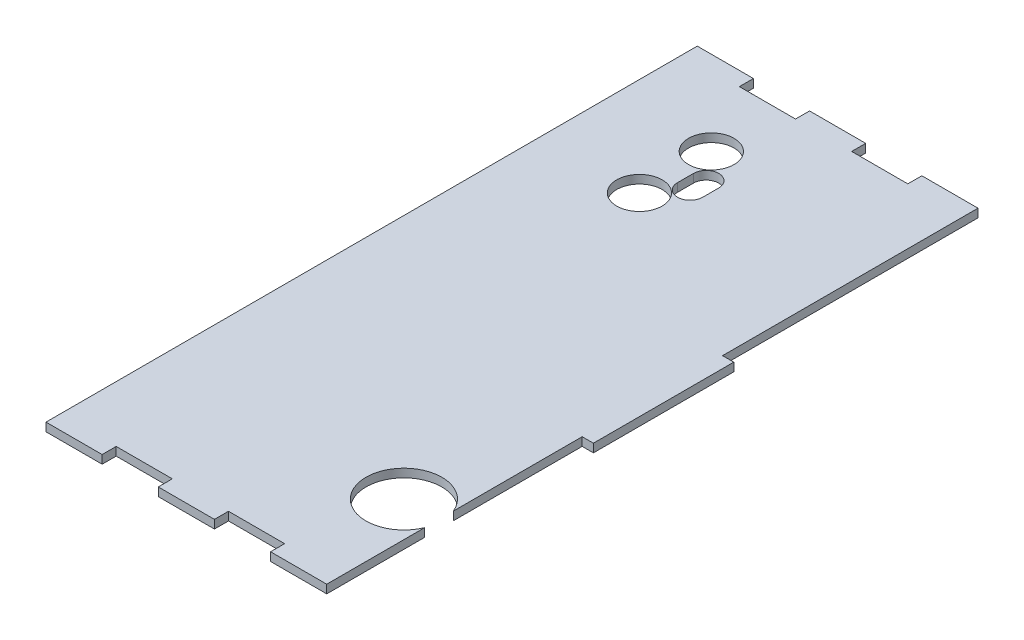
ISO-10303-21;
HEADER;
FILE_DESCRIPTION(('STEP AP214'),'2;1');
FILE_NAME('part.step','',(''),(''),'','','');
FILE_SCHEMA(('AUTOMOTIVE_DESIGN { 1 0 10303 214 1 1 1 1 }'));
ENDSEC;
DATA;
#1=APPLICATION_CONTEXT('core data for automotive mechanical design processes');
#2=APPLICATION_PROTOCOL_DEFINITION('international standard','automotive_design',2000,#1);
#3=PRODUCT_CONTEXT('',#1,'mechanical');
#4=PRODUCT('Part','Part','',(#3));
#5=PRODUCT_RELATED_PRODUCT_CATEGORY('part','',(#4));
#6=PRODUCT_DEFINITION_FORMATION('','',#4);
#7=PRODUCT_DEFINITION_CONTEXT('part definition',#1,'design');
#8=PRODUCT_DEFINITION('design','',#6,#7);
#9=PRODUCT_DEFINITION_SHAPE('','',#8);
#10=(LENGTH_UNIT() NAMED_UNIT(*) SI_UNIT(.MILLI.,.METRE.));
#11=(NAMED_UNIT(*) PLANE_ANGLE_UNIT() SI_UNIT($,.RADIAN.));
#12=(NAMED_UNIT(*) SI_UNIT($,.STERADIAN.) SOLID_ANGLE_UNIT());
#13=UNCERTAINTY_MEASURE_WITH_UNIT(LENGTH_MEASURE(1.E-05),#10,'distance_accuracy_value','');
#14=(GEOMETRIC_REPRESENTATION_CONTEXT(3) GLOBAL_UNCERTAINTY_ASSIGNED_CONTEXT((#13)) GLOBAL_UNIT_ASSIGNED_CONTEXT((#10,
#11,#12)) REPRESENTATION_CONTEXT('',''));
#15=CARTESIAN_POINT('',(0.,0.,0.));
#16=DIRECTION('',(0.,0.,1.));
#17=DIRECTION('',(1.,0.,0.));
#18=AXIS2_PLACEMENT_3D('',#15,#16,#17);
#19=CARTESIAN_POINT('',(37.5,3.,76.));
#20=DIRECTION('',(0.,1.,0.));
#21=DIRECTION('',(0.,0.,1.));
#22=AXIS2_PLACEMENT_3D('',#19,#20,#21);
#23=PLANE('',#22);
#24=CARTESIAN_POINT('',(-15.,3.,-60.4));
#25=DIRECTION('',(0.,1.,0.));
#26=DIRECTION('',(0.,0.,1.));
#27=AXIS2_PLACEMENT_3D('',#24,#25,#26);
#28=CIRCLE('',#27,8.09999999999999);
#29=CARTESIAN_POINT('',(-15.,3.,-52.3));
#30=VERTEX_POINT('',#29);
#31=EDGE_CURVE('E293',#30,#30,#28,.T.);
#32=ORIENTED_EDGE('',*,*,#31,.F.);
#33=EDGE_LOOP('',(#32));
#34=FACE_BOUND('',#33,.T.);
#35=DIRECTION('',(0.,0.,1.));
#36=VECTOR('',#35,1.);
#37=CARTESIAN_POINT('',(-50.,3.,-111.));
#38=LINE('',#37,#36);
#39=CARTESIAN_POINT('',(-50.,3.,-116.));
#40=VERTEX_POINT('',#39);
#41=CARTESIAN_POINT('',(-50.,3.,116.));
#42=VERTEX_POINT('',#41);
#43=EDGE_CURVE('E301',#40,#42,#38,.T.);
#44=ORIENTED_EDGE('',*,*,#43,.T.);
#45=DIRECTION('',(1.,0.,0.));
#46=VECTOR('',#45,1.);
#47=CARTESIAN_POINT('',(-50.,3.,116.));
#48=LINE('',#47,#46);
#49=CARTESIAN_POINT('',(-30.,3.,116.));
#50=VERTEX_POINT('',#49);
#51=EDGE_CURVE('E304',#42,#50,#48,.T.);
#52=ORIENTED_EDGE('',*,*,#51,.T.);
#53=DIRECTION('',(0.,0.,-1.));
#54=VECTOR('',#53,1.);
#55=CARTESIAN_POINT('',(-30.,3.,116.));
#56=LINE('',#55,#54);
#57=CARTESIAN_POINT('',(-30.,3.,111.));
#58=VERTEX_POINT('',#57);
#59=EDGE_CURVE('E308',#50,#58,#56,.T.);
#60=ORIENTED_EDGE('',*,*,#59,.T.);
#61=DIRECTION('',(1.,0.,0.));
#62=VECTOR('',#61,1.);
#63=CARTESIAN_POINT('',(-9.99999999999999,3.,111.));
#64=LINE('',#63,#62);
#65=CARTESIAN_POINT('',(-9.99999999999999,3.,111.));
#66=VERTEX_POINT('',#65);
#67=EDGE_CURVE('E311',#58,#66,#64,.T.);
#68=ORIENTED_EDGE('',*,*,#67,.T.);
#69=DIRECTION('',(0.,0.,1.));
#70=VECTOR('',#69,1.);
#71=CARTESIAN_POINT('',(-9.99999999999999,3.,111.));
#72=LINE('',#71,#70);
#73=CARTESIAN_POINT('',(-9.99999999999999,3.,116.));
#74=VERTEX_POINT('',#73);
#75=EDGE_CURVE('E314',#66,#74,#72,.T.);
#76=ORIENTED_EDGE('',*,*,#75,.T.);
#77=DIRECTION('',(1.,0.,0.));
#78=VECTOR('',#77,1.);
#79=CARTESIAN_POINT('',(-9.99999999999999,3.,116.));
#80=LINE('',#79,#78);
#81=CARTESIAN_POINT('',(10.,3.,116.));
#82=VERTEX_POINT('',#81);
#83=EDGE_CURVE('E317',#74,#82,#80,.T.);
#84=ORIENTED_EDGE('',*,*,#83,.T.);
#85=DIRECTION('',(0.,0.,-1.));
#86=VECTOR('',#85,1.);
#87=CARTESIAN_POINT('',(10.,3.,116.));
#88=LINE('',#87,#86);
#89=CARTESIAN_POINT('',(10.,3.,111.));
#90=VERTEX_POINT('',#89);
#91=EDGE_CURVE('E320',#82,#90,#88,.T.);
#92=ORIENTED_EDGE('',*,*,#91,.T.);
#93=DIRECTION('',(1.,0.,0.));
#94=VECTOR('',#93,1.);
#95=CARTESIAN_POINT('',(30.,3.,111.));
#96=LINE('',#95,#94);
#97=CARTESIAN_POINT('',(30.,3.,111.));
#98=VERTEX_POINT('',#97);
#99=EDGE_CURVE('E323',#90,#98,#96,.T.);
#100=ORIENTED_EDGE('',*,*,#99,.T.);
#101=DIRECTION('',(0.,0.,1.));
#102=VECTOR('',#101,1.);
#103=CARTESIAN_POINT('',(30.,3.,111.));
#104=LINE('',#103,#102);
#105=CARTESIAN_POINT('',(30.,3.,116.));
#106=VERTEX_POINT('',#105);
#107=EDGE_CURVE('E326',#98,#106,#104,.T.);
#108=ORIENTED_EDGE('',*,*,#107,.T.);
#109=DIRECTION('',(1.,0.,0.));
#110=VECTOR('',#109,1.);
#111=CARTESIAN_POINT('',(30.,3.,116.));
#112=LINE('',#111,#110);
#113=CARTESIAN_POINT('',(50.,3.,116.));
#114=VERTEX_POINT('',#113);
#115=EDGE_CURVE('E329',#106,#114,#112,.T.);
#116=ORIENTED_EDGE('',*,*,#115,.T.);
#117=DIRECTION('',(0.,0.,-1.));
#118=VECTOR('',#117,1.);
#119=CARTESIAN_POINT('',(50.,3.,116.));
#120=LINE('',#119,#118);
#121=CARTESIAN_POINT('',(50.,3.,81.0990195135928));
#122=VERTEX_POINT('',#121);
#123=EDGE_CURVE('E332',#114,#122,#120,.T.);
#124=ORIENTED_EDGE('',*,*,#123,.T.);
#125=CARTESIAN_POINT('',(37.5,3.,76.));
#126=DIRECTION('',(0.,-1.,0.));
#127=DIRECTION('',(0.,0.,1.));
#128=AXIS2_PLACEMENT_3D('',#125,#126,#127);
#129=CIRCLE('',#128,13.5);
#130=CARTESIAN_POINT('',(50.,3.,70.9009804864072));
#131=VERTEX_POINT('',#130);
#132=EDGE_CURVE('E335',#122,#131,#129,.T.);
#133=ORIENTED_EDGE('',*,*,#132,.T.);
#134=DIRECTION('',(0.,0.,-1.));
#135=VECTOR('',#134,1.);
#136=CARTESIAN_POINT('',(50.,3.,25.));
#137=LINE('',#136,#135);
#138=CARTESIAN_POINT('',(50.,3.,25.));
#139=VERTEX_POINT('',#138);
#140=EDGE_CURVE('E338',#131,#139,#137,.T.);
#141=ORIENTED_EDGE('',*,*,#140,.T.);
#142=DIRECTION('',(1.,0.,0.));
#143=VECTOR('',#142,1.);
#144=CARTESIAN_POINT('',(50.,3.,25.));
#145=LINE('',#144,#143);
#146=CARTESIAN_POINT('',(54.,3.,25.));
#147=VERTEX_POINT('',#146);
#148=EDGE_CURVE('E341',#139,#147,#145,.T.);
#149=ORIENTED_EDGE('',*,*,#148,.T.);
#150=DIRECTION('',(0.,0.,-1.));
#151=VECTOR('',#150,1.);
#152=CARTESIAN_POINT('',(54.,3.,25.));
#153=LINE('',#152,#151);
#154=CARTESIAN_POINT('',(54.,3.,-25.));
#155=VERTEX_POINT('',#154);
#156=EDGE_CURVE('E344',#147,#155,#153,.T.);
#157=ORIENTED_EDGE('',*,*,#156,.T.);
#158=DIRECTION('',(-1.,0.,0.));
#159=VECTOR('',#158,1.);
#160=CARTESIAN_POINT('',(50.,3.,-25.));
#161=LINE('',#160,#159);
#162=CARTESIAN_POINT('',(50.,3.,-25.));
#163=VERTEX_POINT('',#162);
#164=EDGE_CURVE('E347',#155,#163,#161,.T.);
#165=ORIENTED_EDGE('',*,*,#164,.T.);
#166=DIRECTION('',(0.,0.,-1.));
#167=VECTOR('',#166,1.);
#168=CARTESIAN_POINT('',(50.,3.,-111.));
#169=LINE('',#168,#167);
#170=CARTESIAN_POINT('',(49.9999999999999,3.,-116.));
#171=VERTEX_POINT('',#170);
#172=EDGE_CURVE('E350',#163,#171,#169,.T.);
#173=ORIENTED_EDGE('',*,*,#172,.T.);
#174=DIRECTION('',(-1.,0.,0.));
#175=VECTOR('',#174,1.);
#176=CARTESIAN_POINT('',(29.9999999999999,3.,-116.));
#177=LINE('',#176,#175);
#178=CARTESIAN_POINT('',(29.9999999999999,3.,-116.));
#179=VERTEX_POINT('',#178);
#180=EDGE_CURVE('E353',#171,#179,#177,.T.);
#181=ORIENTED_EDGE('',*,*,#180,.T.);
#182=DIRECTION('',(0.,0.,1.));
#183=VECTOR('',#182,1.);
#184=CARTESIAN_POINT('',(29.9999999999999,3.,-111.));
#185=LINE('',#184,#183);
#186=CARTESIAN_POINT('',(29.9999999999999,3.,-111.));
#187=VERTEX_POINT('',#186);
#188=EDGE_CURVE('E356',#179,#187,#185,.T.);
#189=ORIENTED_EDGE('',*,*,#188,.T.);
#190=DIRECTION('',(-1.,0.,0.));
#191=VECTOR('',#190,1.);
#192=CARTESIAN_POINT('',(29.9999999999999,3.,-111.));
#193=LINE('',#192,#191);
#194=CARTESIAN_POINT('',(9.99999999999993,3.,-111.));
#195=VERTEX_POINT('',#194);
#196=EDGE_CURVE('E359',#187,#195,#193,.T.);
#197=ORIENTED_EDGE('',*,*,#196,.T.);
#198=DIRECTION('',(0.,0.,-1.));
#199=VECTOR('',#198,1.);
#200=CARTESIAN_POINT('',(9.99999999999991,3.,-116.));
#201=LINE('',#200,#199);
#202=CARTESIAN_POINT('',(9.99999999999991,3.,-116.));
#203=VERTEX_POINT('',#202);
#204=EDGE_CURVE('E362',#195,#203,#201,.T.);
#205=ORIENTED_EDGE('',*,*,#204,.T.);
#206=DIRECTION('',(-1.,0.,0.));
#207=VECTOR('',#206,1.);
#208=CARTESIAN_POINT('',(-10.0000000000001,3.,-116.));
#209=LINE('',#208,#207);
#210=CARTESIAN_POINT('',(-10.0000000000001,3.,-116.));
#211=VERTEX_POINT('',#210);
#212=EDGE_CURVE('E365',#203,#211,#209,.T.);
#213=ORIENTED_EDGE('',*,*,#212,.T.);
#214=DIRECTION('',(0.,0.,1.));
#215=VECTOR('',#214,1.);
#216=CARTESIAN_POINT('',(-10.0000000000001,3.,-111.));
#217=LINE('',#216,#215);
#218=CARTESIAN_POINT('',(-10.0000000000001,3.,-111.));
#219=VERTEX_POINT('',#218);
#220=EDGE_CURVE('E368',#211,#219,#217,.T.);
#221=ORIENTED_EDGE('',*,*,#220,.T.);
#222=DIRECTION('',(-1.,0.,0.));
#223=VECTOR('',#222,1.);
#224=CARTESIAN_POINT('',(-10.0000000000001,3.,-111.));
#225=LINE('',#224,#223);
#226=CARTESIAN_POINT('',(-30.0000000000001,3.,-111.));
#227=VERTEX_POINT('',#226);
#228=EDGE_CURVE('E371',#219,#227,#225,.T.);
#229=ORIENTED_EDGE('',*,*,#228,.T.);
#230=DIRECTION('',(0.,0.,-1.));
#231=VECTOR('',#230,1.);
#232=CARTESIAN_POINT('',(-30.0000000000001,3.,-116.));
#233=LINE('',#232,#231);
#234=CARTESIAN_POINT('',(-30.0000000000001,3.,-116.));
#235=VERTEX_POINT('',#234);
#236=EDGE_CURVE('E374',#227,#235,#233,.T.);
#237=ORIENTED_EDGE('',*,*,#236,.T.);
#238=DIRECTION('',(-1.,0.,0.));
#239=VECTOR('',#238,1.);
#240=CARTESIAN_POINT('',(-50.,3.,-116.));
#241=LINE('',#240,#239);
#242=EDGE_CURVE('E377',#235,#40,#241,.T.);
#243=ORIENTED_EDGE('',*,*,#242,.T.);
#244=EDGE_LOOP('',(#44,#52,#60,#68,#76,#84,#92,#100,#108,#116,#124,#133,#141,#149,#157,#165,
#173,#181,#189,#197,#205,#213,#221,#229,#237,#243));
#245=FACE_BOUND('',#244,.T.);
#246=CARTESIAN_POINT('',(-15.,3.,-86.));
#247=DIRECTION('',(0.,1.,0.));
#248=DIRECTION('',(0.,0.,1.));
#249=AXIS2_PLACEMENT_3D('',#246,#247,#248);
#250=CIRCLE('',#249,8.09999999999999);
#251=CARTESIAN_POINT('',(-15.,3.,-77.9));
#252=VERTEX_POINT('',#251);
#253=EDGE_CURVE('E285',#252,#252,#250,.T.);
#254=ORIENTED_EDGE('',*,*,#253,.F.);
#255=EDGE_LOOP('',(#254));
#256=FACE_BOUND('',#255,.T.);
#257=DIRECTION('',(0.,0.,-1.));
#258=VECTOR('',#257,1.);
#259=CARTESIAN_POINT('',(-2.4,3.,-70.35));
#260=LINE('',#259,#258);
#261=CARTESIAN_POINT('',(-2.4,3.,-70.35));
#262=VERTEX_POINT('',#261);
#263=CARTESIAN_POINT('',(-2.4,3.,-76.05));
#264=VERTEX_POINT('',#263);
#265=EDGE_CURVE('E246',#262,#264,#260,.T.);
#266=ORIENTED_EDGE('',*,*,#265,.F.);
#267=CARTESIAN_POINT('',(-6.9,3.,-70.35));
#268=DIRECTION('',(0.,1.,0.));
#269=DIRECTION('',(0.,0.,1.));
#270=AXIS2_PLACEMENT_3D('',#267,#268,#269);
#271=CIRCLE('',#270,4.5);
#272=CARTESIAN_POINT('',(-11.4,3.,-70.35));
#273=VERTEX_POINT('',#272);
#274=EDGE_CURVE('E237',#273,#262,#271,.T.);
#275=ORIENTED_EDGE('',*,*,#274,.F.);
#276=DIRECTION('',(0.,0.,1.));
#277=VECTOR('',#276,1.);
#278=CARTESIAN_POINT('',(-11.4,3.,-70.35));
#279=LINE('',#278,#277);
#280=CARTESIAN_POINT('',(-11.4,3.,-76.05));
#281=VERTEX_POINT('',#280);
#282=EDGE_CURVE('E263',#281,#273,#279,.T.);
#283=ORIENTED_EDGE('',*,*,#282,.F.);
#284=CARTESIAN_POINT('',(-6.9,3.,-76.05));
#285=DIRECTION('',(0.,1.,0.));
#286=DIRECTION('',(0.,0.,1.));
#287=AXIS2_PLACEMENT_3D('',#284,#285,#286);
#288=CIRCLE('',#287,4.5);
#289=EDGE_CURVE('E259',#264,#281,#288,.T.);
#290=ORIENTED_EDGE('',*,*,#289,.F.);
#291=EDGE_LOOP('',(#266,#275,#283,#290));
#292=FACE_BOUND('',#291,.T.);
#293=ADVANCED_FACE('F39',(#34,#245,#256,#292),#23,.T.);
#294=CARTESIAN_POINT('',(37.5,0.,76.));
#295=DIRECTION('',(0.,1.,0.));
#296=DIRECTION('',(0.,0.,1.));
#297=AXIS2_PLACEMENT_3D('',#294,#295,#296);
#298=PLANE('',#297);
#299=CARTESIAN_POINT('',(-15.,0.,-86.));
#300=DIRECTION('',(0.,1.,0.));
#301=DIRECTION('',(0.,0.,1.));
#302=AXIS2_PLACEMENT_3D('',#299,#300,#301);
#303=CIRCLE('',#302,8.09999999999999);
#304=CARTESIAN_POINT('',(-15.,0.,-77.9));
#305=VERTEX_POINT('',#304);
#306=EDGE_CURVE('E255',#305,#305,#303,.T.);
#307=ORIENTED_EDGE('',*,*,#306,.T.);
#308=EDGE_LOOP('',(#307));
#309=FACE_BOUND('',#308,.T.);
#310=CARTESIAN_POINT('',(-15.,0.,-60.4));
#311=DIRECTION('',(0.,1.,0.));
#312=DIRECTION('',(0.,0.,1.));
#313=AXIS2_PLACEMENT_3D('',#310,#311,#312);
#314=CIRCLE('',#313,8.09999999999999);
#315=CARTESIAN_POINT('',(-15.,0.,-52.3));
#316=VERTEX_POINT('',#315);
#317=EDGE_CURVE('E289',#316,#316,#314,.T.);
#318=ORIENTED_EDGE('',*,*,#317,.T.);
#319=EDGE_LOOP('',(#318));
#320=FACE_BOUND('',#319,.T.);
#321=DIRECTION('',(1.,0.,0.));
#322=VECTOR('',#321,1.);
#323=CARTESIAN_POINT('',(-50.,0.,116.));
#324=LINE('',#323,#322);
#325=CARTESIAN_POINT('',(-50.,0.,116.));
#326=VERTEX_POINT('',#325);
#327=CARTESIAN_POINT('',(-30.,0.,116.));
#328=VERTEX_POINT('',#327);
#329=EDGE_CURVE('E297',#326,#328,#324,.T.);
#330=ORIENTED_EDGE('',*,*,#329,.F.);
#331=DIRECTION('',(0.,0.,1.));
#332=VECTOR('',#331,1.);
#333=CARTESIAN_POINT('',(-50.,0.,-111.));
#334=LINE('',#333,#332);
#335=CARTESIAN_POINT('',(-50.,0.,-116.));
#336=VERTEX_POINT('',#335);
#337=EDGE_CURVE('E305',#336,#326,#334,.T.);
#338=ORIENTED_EDGE('',*,*,#337,.F.);
#339=DIRECTION('',(-1.,0.,0.));
#340=VECTOR('',#339,1.);
#341=CARTESIAN_POINT('',(-50.,0.,-116.));
#342=LINE('',#341,#340);
#343=CARTESIAN_POINT('',(-30.0000000000001,0.,-116.));
#344=VERTEX_POINT('',#343);
#345=EDGE_CURVE('E455',#344,#336,#342,.T.);
#346=ORIENTED_EDGE('',*,*,#345,.F.);
#347=DIRECTION('',(0.,0.,-1.));
#348=VECTOR('',#347,1.);
#349=CARTESIAN_POINT('',(-30.0000000000001,0.,-116.));
#350=LINE('',#349,#348);
#351=CARTESIAN_POINT('',(-30.0000000000001,0.,-111.));
#352=VERTEX_POINT('',#351);
#353=EDGE_CURVE('E452',#352,#344,#350,.T.);
#354=ORIENTED_EDGE('',*,*,#353,.F.);
#355=DIRECTION('',(-1.,0.,0.));
#356=VECTOR('',#355,1.);
#357=CARTESIAN_POINT('',(-10.0000000000001,0.,-111.));
#358=LINE('',#357,#356);
#359=CARTESIAN_POINT('',(-10.0000000000001,0.,-111.));
#360=VERTEX_POINT('',#359);
#361=EDGE_CURVE('E449',#360,#352,#358,.T.);
#362=ORIENTED_EDGE('',*,*,#361,.F.);
#363=DIRECTION('',(0.,0.,1.));
#364=VECTOR('',#363,1.);
#365=CARTESIAN_POINT('',(-10.0000000000001,0.,-111.));
#366=LINE('',#365,#364);
#367=CARTESIAN_POINT('',(-10.0000000000001,0.,-116.));
#368=VERTEX_POINT('',#367);
#369=EDGE_CURVE('E446',#368,#360,#366,.T.);
#370=ORIENTED_EDGE('',*,*,#369,.F.);
#371=DIRECTION('',(-1.,0.,0.));
#372=VECTOR('',#371,1.);
#373=CARTESIAN_POINT('',(-10.0000000000001,0.,-116.));
#374=LINE('',#373,#372);
#375=CARTESIAN_POINT('',(9.99999999999991,0.,-116.));
#376=VERTEX_POINT('',#375);
#377=EDGE_CURVE('E443',#376,#368,#374,.T.);
#378=ORIENTED_EDGE('',*,*,#377,.F.);
#379=DIRECTION('',(0.,0.,-1.));
#380=VECTOR('',#379,1.);
#381=CARTESIAN_POINT('',(9.99999999999991,0.,-116.));
#382=LINE('',#381,#380);
#383=CARTESIAN_POINT('',(9.99999999999993,0.,-111.));
#384=VERTEX_POINT('',#383);
#385=EDGE_CURVE('E440',#384,#376,#382,.T.);
#386=ORIENTED_EDGE('',*,*,#385,.F.);
#387=DIRECTION('',(-1.,0.,0.));
#388=VECTOR('',#387,1.);
#389=CARTESIAN_POINT('',(29.9999999999999,0.,-111.));
#390=LINE('',#389,#388);
#391=CARTESIAN_POINT('',(29.9999999999999,0.,-111.));
#392=VERTEX_POINT('',#391);
#393=EDGE_CURVE('E437',#392,#384,#390,.T.);
#394=ORIENTED_EDGE('',*,*,#393,.F.);
#395=DIRECTION('',(0.,0.,1.));
#396=VECTOR('',#395,1.);
#397=CARTESIAN_POINT('',(29.9999999999999,0.,-111.));
#398=LINE('',#397,#396);
#399=CARTESIAN_POINT('',(29.9999999999999,0.,-116.));
#400=VERTEX_POINT('',#399);
#401=EDGE_CURVE('E434',#400,#392,#398,.T.);
#402=ORIENTED_EDGE('',*,*,#401,.F.);
#403=DIRECTION('',(-1.,0.,0.));
#404=VECTOR('',#403,1.);
#405=CARTESIAN_POINT('',(29.9999999999999,0.,-116.));
#406=LINE('',#405,#404);
#407=CARTESIAN_POINT('',(49.9999999999999,0.,-116.));
#408=VERTEX_POINT('',#407);
#409=EDGE_CURVE('E431',#408,#400,#406,.T.);
#410=ORIENTED_EDGE('',*,*,#409,.F.);
#411=DIRECTION('',(0.,0.,-1.));
#412=VECTOR('',#411,1.);
#413=CARTESIAN_POINT('',(49.9999999999999,0.,-116.));
#414=LINE('',#413,#412);
#415=CARTESIAN_POINT('',(50.,0.,-25.));
#416=VERTEX_POINT('',#415);
#417=EDGE_CURVE('E428',#416,#408,#414,.T.);
#418=ORIENTED_EDGE('',*,*,#417,.F.);
#419=DIRECTION('',(-1.,0.,0.));
#420=VECTOR('',#419,1.);
#421=CARTESIAN_POINT('',(50.,0.,-25.));
#422=LINE('',#421,#420);
#423=CARTESIAN_POINT('',(54.,0.,-25.));
#424=VERTEX_POINT('',#423);
#425=EDGE_CURVE('E424',#424,#416,#422,.T.);
#426=ORIENTED_EDGE('',*,*,#425,.F.);
#427=DIRECTION('',(0.,0.,-1.));
#428=VECTOR('',#427,1.);
#429=CARTESIAN_POINT('',(54.,0.,25.));
#430=LINE('',#429,#428);
#431=CARTESIAN_POINT('',(54.,0.,25.));
#432=VERTEX_POINT('',#431);
#433=EDGE_CURVE('E421',#432,#424,#430,.T.);
#434=ORIENTED_EDGE('',*,*,#433,.F.);
#435=DIRECTION('',(1.,0.,0.));
#436=VECTOR('',#435,1.);
#437=CARTESIAN_POINT('',(50.,0.,25.));
#438=LINE('',#437,#436);
#439=CARTESIAN_POINT('',(50.,0.,25.));
#440=VERTEX_POINT('',#439);
#441=EDGE_CURVE('E418',#440,#432,#438,.T.);
#442=ORIENTED_EDGE('',*,*,#441,.F.);
#443=DIRECTION('',(0.,0.,-1.));
#444=VECTOR('',#443,1.);
#445=CARTESIAN_POINT('',(50.,0.,25.));
#446=LINE('',#445,#444);
#447=CARTESIAN_POINT('',(50.,0.,70.9009804864072));
#448=VERTEX_POINT('',#447);
#449=EDGE_CURVE('E415',#448,#440,#446,.T.);
#450=ORIENTED_EDGE('',*,*,#449,.F.);
#451=CARTESIAN_POINT('',(37.5,0.,76.));
#452=DIRECTION('',(0.,-1.,0.));
#453=DIRECTION('',(0.,0.,1.));
#454=AXIS2_PLACEMENT_3D('',#451,#452,#453);
#455=CIRCLE('',#454,13.5);
#456=CARTESIAN_POINT('',(50.,0.,81.0990195135928));
#457=VERTEX_POINT('',#456);
#458=EDGE_CURVE('E412',#457,#448,#455,.T.);
#459=ORIENTED_EDGE('',*,*,#458,.F.);
#460=DIRECTION('',(0.,0.,-1.));
#461=VECTOR('',#460,1.);
#462=CARTESIAN_POINT('',(50.,0.,81.0990195135928));
#463=LINE('',#462,#461);
#464=CARTESIAN_POINT('',(50.,0.,116.));
#465=VERTEX_POINT('',#464);
#466=EDGE_CURVE('E409',#465,#457,#463,.T.);
#467=ORIENTED_EDGE('',*,*,#466,.F.);
#468=DIRECTION('',(1.,0.,0.));
#469=VECTOR('',#468,1.);
#470=CARTESIAN_POINT('',(30.,0.,116.));
#471=LINE('',#470,#469);
#472=CARTESIAN_POINT('',(30.,0.,116.));
#473=VERTEX_POINT('',#472);
#474=EDGE_CURVE('E405',#473,#465,#471,.T.);
#475=ORIENTED_EDGE('',*,*,#474,.F.);
#476=DIRECTION('',(0.,0.,1.));
#477=VECTOR('',#476,1.);
#478=CARTESIAN_POINT('',(30.,0.,111.));
#479=LINE('',#478,#477);
#480=CARTESIAN_POINT('',(30.,0.,111.));
#481=VERTEX_POINT('',#480);
#482=EDGE_CURVE('E402',#481,#473,#479,.T.);
#483=ORIENTED_EDGE('',*,*,#482,.F.);
#484=DIRECTION('',(1.,0.,0.));
#485=VECTOR('',#484,1.);
#486=CARTESIAN_POINT('',(30.,0.,111.));
#487=LINE('',#486,#485);
#488=CARTESIAN_POINT('',(10.,0.,111.));
#489=VERTEX_POINT('',#488);
#490=EDGE_CURVE('E399',#489,#481,#487,.T.);
#491=ORIENTED_EDGE('',*,*,#490,.F.);
#492=DIRECTION('',(0.,0.,-1.));
#493=VECTOR('',#492,1.);
#494=CARTESIAN_POINT('',(10.,0.,116.));
#495=LINE('',#494,#493);
#496=CARTESIAN_POINT('',(10.,0.,116.));
#497=VERTEX_POINT('',#496);
#498=EDGE_CURVE('E396',#497,#489,#495,.T.);
#499=ORIENTED_EDGE('',*,*,#498,.F.);
#500=DIRECTION('',(1.,0.,0.));
#501=VECTOR('',#500,1.);
#502=CARTESIAN_POINT('',(-9.99999999999999,0.,116.));
#503=LINE('',#502,#501);
#504=CARTESIAN_POINT('',(-9.99999999999999,0.,116.));
#505=VERTEX_POINT('',#504);
#506=EDGE_CURVE('E393',#505,#497,#503,.T.);
#507=ORIENTED_EDGE('',*,*,#506,.F.);
#508=DIRECTION('',(0.,0.,1.));
#509=VECTOR('',#508,1.);
#510=CARTESIAN_POINT('',(-9.99999999999999,0.,111.));
#511=LINE('',#510,#509);
#512=CARTESIAN_POINT('',(-9.99999999999999,0.,111.));
#513=VERTEX_POINT('',#512);
#514=EDGE_CURVE('E390',#513,#505,#511,.T.);
#515=ORIENTED_EDGE('',*,*,#514,.F.);
#516=DIRECTION('',(1.,0.,0.));
#517=VECTOR('',#516,1.);
#518=CARTESIAN_POINT('',(-9.99999999999999,0.,111.));
#519=LINE('',#518,#517);
#520=CARTESIAN_POINT('',(-30.,0.,111.));
#521=VERTEX_POINT('',#520);
#522=EDGE_CURVE('E387',#521,#513,#519,.T.);
#523=ORIENTED_EDGE('',*,*,#522,.F.);
#524=DIRECTION('',(0.,0.,-1.));
#525=VECTOR('',#524,1.);
#526=CARTESIAN_POINT('',(-30.,0.,116.));
#527=LINE('',#526,#525);
#528=EDGE_CURVE('E384',#328,#521,#527,.T.);
#529=ORIENTED_EDGE('',*,*,#528,.F.);
#530=EDGE_LOOP('',(#330,#338,#346,#354,#362,#370,#378,#386,#394,#402,#410,#418,#426,#434,#442,
#450,#459,#467,#475,#483,#491,#499,#507,#515,#523,#529));
#531=FACE_BOUND('',#530,.T.);
#532=CARTESIAN_POINT('',(-6.9,0.,-70.35));
#533=DIRECTION('',(0.,1.,0.));
#534=DIRECTION('',(0.,0.,1.));
#535=AXIS2_PLACEMENT_3D('',#532,#533,#534);
#536=CIRCLE('',#535,4.5);
#537=CARTESIAN_POINT('',(-11.4,0.,-70.35));
#538=VERTEX_POINT('',#537);
#539=CARTESIAN_POINT('',(-2.4,0.,-70.35));
#540=VERTEX_POINT('',#539);
#541=EDGE_CURVE('E63',#538,#540,#536,.T.);
#542=ORIENTED_EDGE('',*,*,#541,.T.);
#543=DIRECTION('',(0.,0.,-1.));
#544=VECTOR('',#543,1.);
#545=CARTESIAN_POINT('',(-2.4,0.,-70.35));
#546=LINE('',#545,#544);
#547=CARTESIAN_POINT('',(-2.4,0.,-76.05));
#548=VERTEX_POINT('',#547);
#549=EDGE_CURVE('E253',#540,#548,#546,.T.);
#550=ORIENTED_EDGE('',*,*,#549,.T.);
#551=CARTESIAN_POINT('',(-6.9,0.,-76.05));
#552=DIRECTION('',(0.,1.,0.));
#553=DIRECTION('',(0.,0.,1.));
#554=AXIS2_PLACEMENT_3D('',#551,#552,#553);
#555=CIRCLE('',#554,4.5);
#556=CARTESIAN_POINT('',(-11.4,0.,-76.05));
#557=VERTEX_POINT('',#556);
#558=EDGE_CURVE('E272',#548,#557,#555,.T.);
#559=ORIENTED_EDGE('',*,*,#558,.T.);
#560=DIRECTION('',(0.,0.,1.));
#561=VECTOR('',#560,1.);
#562=CARTESIAN_POINT('',(-11.4,0.,-70.35));
#563=LINE('',#562,#561);
#564=EDGE_CURVE('E247',#557,#538,#563,.T.);
#565=ORIENTED_EDGE('',*,*,#564,.T.);
#566=EDGE_LOOP('',(#542,#550,#559,#565));
#567=FACE_BOUND('',#566,.T.);
#568=ADVANCED_FACE('F567',(#309,#320,#531,#567),#298,.F.);
#569=CARTESIAN_POINT('',(-50.,3.,116.));
#570=DIRECTION('',(0.,0.,-1.));
#571=DIRECTION('',(-1.,0.,0.));
#572=AXIS2_PLACEMENT_3D('',#569,#570,#571);
#573=PLANE('',#572);
#574=ORIENTED_EDGE('',*,*,#329,.T.);
#575=DIRECTION('',(0.,-1.,0.));
#576=VECTOR('',#575,1.);
#577=CARTESIAN_POINT('',(-30.,3.,116.));
#578=LINE('',#577,#576);
#579=EDGE_CURVE('E48',#50,#328,#578,.T.);
#580=ORIENTED_EDGE('',*,*,#579,.F.);
#581=ORIENTED_EDGE('',*,*,#51,.F.);
#582=DIRECTION('',(0.,-1.,0.));
#583=VECTOR('',#582,1.);
#584=CARTESIAN_POINT('',(-50.,3.,116.));
#585=LINE('',#584,#583);
#586=EDGE_CURVE('E11',#42,#326,#585,.T.);
#587=ORIENTED_EDGE('',*,*,#586,.T.);
#588=EDGE_LOOP('',(#574,#580,#581,#587));
#589=FACE_BOUND('',#588,.T.);
#590=ADVANCED_FACE('F41',(#589),#573,.F.);
#591=CARTESIAN_POINT('',(-30.,3.,116.));
#592=DIRECTION('',(-1.,0.,0.));
#593=DIRECTION('',(0.,0.,1.));
#594=AXIS2_PLACEMENT_3D('',#591,#592,#593);
#595=PLANE('',#594);
#596=ORIENTED_EDGE('',*,*,#528,.T.);
#597=DIRECTION('',(0.,-1.,0.));
#598=VECTOR('',#597,1.);
#599=CARTESIAN_POINT('',(-30.,3.,111.));
#600=LINE('',#599,#598);
#601=EDGE_CURVE('E551',#58,#521,#600,.T.);
#602=ORIENTED_EDGE('',*,*,#601,.F.);
#603=ORIENTED_EDGE('',*,*,#59,.F.);
#604=ORIENTED_EDGE('',*,*,#579,.T.);
#605=EDGE_LOOP('',(#596,#602,#603,#604));
#606=FACE_BOUND('',#605,.T.);
#607=ADVANCED_FACE('F560',(#606),#595,.F.);
#608=CARTESIAN_POINT('',(-9.99999999999999,3.,111.));
#609=DIRECTION('',(0.,0.,-1.));
#610=DIRECTION('',(-1.,0.,0.));
#611=AXIS2_PLACEMENT_3D('',#608,#609,#610);
#612=PLANE('',#611);
#613=ORIENTED_EDGE('',*,*,#522,.T.);
#614=DIRECTION('',(0.,-1.,0.));
#615=VECTOR('',#614,1.);
#616=CARTESIAN_POINT('',(-9.99999999999999,3.,111.));
#617=LINE('',#616,#615);
#618=EDGE_CURVE('E547',#66,#513,#617,.T.);
#619=ORIENTED_EDGE('',*,*,#618,.F.);
#620=ORIENTED_EDGE('',*,*,#67,.F.);
#621=ORIENTED_EDGE('',*,*,#601,.T.);
#622=EDGE_LOOP('',(#613,#619,#620,#621));
#623=FACE_BOUND('',#622,.T.);
#624=ADVANCED_FACE('F574',(#623),#612,.F.);
#625=CARTESIAN_POINT('',(-9.99999999999999,3.,111.));
#626=DIRECTION('',(1.,0.,0.));
#627=DIRECTION('',(0.,0.,-1.));
#628=AXIS2_PLACEMENT_3D('',#625,#626,#627);
#629=PLANE('',#628);
#630=ORIENTED_EDGE('',*,*,#514,.T.);
#631=DIRECTION('',(0.,-1.,0.));
#632=VECTOR('',#631,1.);
#633=CARTESIAN_POINT('',(-9.99999999999999,3.,116.));
#634=LINE('',#633,#632);
#635=EDGE_CURVE('E543',#74,#505,#634,.T.);
#636=ORIENTED_EDGE('',*,*,#635,.F.);
#637=ORIENTED_EDGE('',*,*,#75,.F.);
#638=ORIENTED_EDGE('',*,*,#618,.T.);
#639=EDGE_LOOP('',(#630,#636,#637,#638));
#640=FACE_BOUND('',#639,.T.);
#641=ADVANCED_FACE('F578',(#640),#629,.F.);
#642=CARTESIAN_POINT('',(-9.99999999999999,3.,116.));
#643=DIRECTION('',(0.,0.,-1.));
#644=DIRECTION('',(-1.,0.,0.));
#645=AXIS2_PLACEMENT_3D('',#642,#643,#644);
#646=PLANE('',#645);
#647=ORIENTED_EDGE('',*,*,#506,.T.);
#648=DIRECTION('',(0.,-1.,0.));
#649=VECTOR('',#648,1.);
#650=CARTESIAN_POINT('',(10.,3.,116.));
#651=LINE('',#650,#649);
#652=EDGE_CURVE('E539',#82,#497,#651,.T.);
#653=ORIENTED_EDGE('',*,*,#652,.F.);
#654=ORIENTED_EDGE('',*,*,#83,.F.);
#655=ORIENTED_EDGE('',*,*,#635,.T.);
#656=EDGE_LOOP('',(#647,#653,#654,#655));
#657=FACE_BOUND('',#656,.T.);
#658=ADVANCED_FACE('F686',(#657),#646,.F.);
#659=CARTESIAN_POINT('',(10.,3.,116.));
#660=DIRECTION('',(-1.,0.,0.));
#661=DIRECTION('',(0.,0.,1.));
#662=AXIS2_PLACEMENT_3D('',#659,#660,#661);
#663=PLANE('',#662);
#664=ORIENTED_EDGE('',*,*,#498,.T.);
#665=DIRECTION('',(0.,-1.,0.));
#666=VECTOR('',#665,1.);
#667=CARTESIAN_POINT('',(10.,3.,111.));
#668=LINE('',#667,#666);
#669=EDGE_CURVE('E535',#90,#489,#668,.T.);
#670=ORIENTED_EDGE('',*,*,#669,.F.);
#671=ORIENTED_EDGE('',*,*,#91,.F.);
#672=ORIENTED_EDGE('',*,*,#652,.T.);
#673=EDGE_LOOP('',(#664,#670,#671,#672));
#674=FACE_BOUND('',#673,.T.);
#675=ADVANCED_FACE('F684',(#674),#663,.F.);
#676=CARTESIAN_POINT('',(30.,3.,111.));
#677=DIRECTION('',(0.,0.,-1.));
#678=DIRECTION('',(-1.,0.,0.));
#679=AXIS2_PLACEMENT_3D('',#676,#677,#678);
#680=PLANE('',#679);
#681=ORIENTED_EDGE('',*,*,#490,.T.);
#682=DIRECTION('',(0.,-1.,0.));
#683=VECTOR('',#682,1.);
#684=CARTESIAN_POINT('',(30.,3.,111.));
#685=LINE('',#684,#683);
#686=EDGE_CURVE('E531',#98,#481,#685,.T.);
#687=ORIENTED_EDGE('',*,*,#686,.F.);
#688=ORIENTED_EDGE('',*,*,#99,.F.);
#689=ORIENTED_EDGE('',*,*,#669,.T.);
#690=EDGE_LOOP('',(#681,#687,#688,#689));
#691=FACE_BOUND('',#690,.T.);
#692=ADVANCED_FACE('F680',(#691),#680,.F.);
#693=CARTESIAN_POINT('',(30.,3.,111.));
#694=DIRECTION('',(1.,0.,0.));
#695=DIRECTION('',(0.,0.,-1.));
#696=AXIS2_PLACEMENT_3D('',#693,#694,#695);
#697=PLANE('',#696);
#698=ORIENTED_EDGE('',*,*,#482,.T.);
#699=DIRECTION('',(0.,-1.,0.));
#700=VECTOR('',#699,1.);
#701=CARTESIAN_POINT('',(30.,3.,116.));
#702=LINE('',#701,#700);
#703=EDGE_CURVE('E527',#106,#473,#702,.T.);
#704=ORIENTED_EDGE('',*,*,#703,.F.);
#705=ORIENTED_EDGE('',*,*,#107,.F.);
#706=ORIENTED_EDGE('',*,*,#686,.T.);
#707=EDGE_LOOP('',(#698,#704,#705,#706));
#708=FACE_BOUND('',#707,.T.);
#709=ADVANCED_FACE('F676',(#708),#697,.F.);
#710=CARTESIAN_POINT('',(30.,3.,116.));
#711=DIRECTION('',(0.,0.,-1.));
#712=DIRECTION('',(-1.,0.,0.));
#713=AXIS2_PLACEMENT_3D('',#710,#711,#712);
#714=PLANE('',#713);
#715=ORIENTED_EDGE('',*,*,#474,.T.);
#716=DIRECTION('',(0.,-1.,0.));
#717=VECTOR('',#716,1.);
#718=CARTESIAN_POINT('',(50.,3.,116.));
#719=LINE('',#718,#717);
#720=EDGE_CURVE('E523',#114,#465,#719,.T.);
#721=ORIENTED_EDGE('',*,*,#720,.F.);
#722=ORIENTED_EDGE('',*,*,#115,.F.);
#723=ORIENTED_EDGE('',*,*,#703,.T.);
#724=EDGE_LOOP('',(#715,#721,#722,#723));
#725=FACE_BOUND('',#724,.T.);
#726=ADVANCED_FACE('F667',(#725),#714,.F.);
#727=CARTESIAN_POINT('',(50.,3.,81.0990195135928));
#728=DIRECTION('',(-1.,0.,0.));
#729=DIRECTION('',(0.,0.,1.));
#730=AXIS2_PLACEMENT_3D('',#727,#728,#729);
#731=PLANE('',#730);
#732=ORIENTED_EDGE('',*,*,#466,.T.);
#733=DIRECTION('',(0.,-1.,0.));
#734=VECTOR('',#733,1.);
#735=CARTESIAN_POINT('',(50.,3.,81.0990195135928));
#736=LINE('',#735,#734);
#737=EDGE_CURVE('E519',#122,#457,#736,.T.);
#738=ORIENTED_EDGE('',*,*,#737,.F.);
#739=ORIENTED_EDGE('',*,*,#123,.F.);
#740=ORIENTED_EDGE('',*,*,#720,.T.);
#741=EDGE_LOOP('',(#732,#738,#739,#740));
#742=FACE_BOUND('',#741,.T.);
#743=ADVANCED_FACE('F671',(#742),#731,.F.);
#744=CARTESIAN_POINT('',(37.5,3.,76.));
#745=DIRECTION('',(0.,-1.,0.));
#746=DIRECTION('',(0.,0.,-1.));
#747=AXIS2_PLACEMENT_3D('',#744,#745,#746);
#748=CYLINDRICAL_SURFACE('',#747,13.5);
#749=ORIENTED_EDGE('',*,*,#458,.T.);
#750=DIRECTION('',(0.,-1.,0.));
#751=VECTOR('',#750,1.);
#752=CARTESIAN_POINT('',(50.,3.,70.9009804864072));
#753=LINE('',#752,#751);
#754=EDGE_CURVE('E515',#131,#448,#753,.T.);
#755=ORIENTED_EDGE('',*,*,#754,.F.);
#756=ORIENTED_EDGE('',*,*,#132,.F.);
#757=ORIENTED_EDGE('',*,*,#737,.T.);
#758=EDGE_LOOP('',(#749,#755,#756,#757));
#759=FACE_BOUND('',#758,.T.);
#760=ADVANCED_FACE('F660',(#759),#748,.F.);
#761=CARTESIAN_POINT('',(50.,3.,25.));
#762=DIRECTION('',(-1.,0.,0.));
#763=DIRECTION('',(0.,0.,1.));
#764=AXIS2_PLACEMENT_3D('',#761,#762,#763);
#765=PLANE('',#764);
#766=ORIENTED_EDGE('',*,*,#449,.T.);
#767=DIRECTION('',(0.,-1.,0.));
#768=VECTOR('',#767,1.);
#769=CARTESIAN_POINT('',(50.,3.,25.));
#770=LINE('',#769,#768);
#771=EDGE_CURVE('E511',#139,#440,#770,.T.);
#772=ORIENTED_EDGE('',*,*,#771,.F.);
#773=ORIENTED_EDGE('',*,*,#140,.F.);
#774=ORIENTED_EDGE('',*,*,#754,.T.);
#775=EDGE_LOOP('',(#766,#772,#773,#774));
#776=FACE_BOUND('',#775,.T.);
#777=ADVANCED_FACE('F656',(#776),#765,.F.);
#778=CARTESIAN_POINT('',(50.,3.,25.));
#779=DIRECTION('',(0.,0.,-1.));
#780=DIRECTION('',(-1.,0.,0.));
#781=AXIS2_PLACEMENT_3D('',#778,#779,#780);
#782=PLANE('',#781);
#783=ORIENTED_EDGE('',*,*,#441,.T.);
#784=DIRECTION('',(0.,-1.,0.));
#785=VECTOR('',#784,1.);
#786=CARTESIAN_POINT('',(54.,3.,25.));
#787=LINE('',#786,#785);
#788=EDGE_CURVE('E507',#147,#432,#787,.T.);
#789=ORIENTED_EDGE('',*,*,#788,.F.);
#790=ORIENTED_EDGE('',*,*,#148,.F.);
#791=ORIENTED_EDGE('',*,*,#771,.T.);
#792=EDGE_LOOP('',(#783,#789,#790,#791));
#793=FACE_BOUND('',#792,.T.);
#794=ADVANCED_FACE('F652',(#793),#782,.F.);
#795=CARTESIAN_POINT('',(54.,3.,25.));
#796=DIRECTION('',(-1.,0.,0.));
#797=DIRECTION('',(0.,0.,1.));
#798=AXIS2_PLACEMENT_3D('',#795,#796,#797);
#799=PLANE('',#798);
#800=ORIENTED_EDGE('',*,*,#433,.T.);
#801=DIRECTION('',(0.,-1.,0.));
#802=VECTOR('',#801,1.);
#803=CARTESIAN_POINT('',(54.,3.,-25.));
#804=LINE('',#803,#802);
#805=EDGE_CURVE('E503',#155,#424,#804,.T.);
#806=ORIENTED_EDGE('',*,*,#805,.F.);
#807=ORIENTED_EDGE('',*,*,#156,.F.);
#808=ORIENTED_EDGE('',*,*,#788,.T.);
#809=EDGE_LOOP('',(#800,#806,#807,#808));
#810=FACE_BOUND('',#809,.T.);
#811=ADVANCED_FACE('F647',(#810),#799,.F.);
#812=CARTESIAN_POINT('',(50.,3.,-25.));
#813=DIRECTION('',(0.,0.,1.));
#814=DIRECTION('',(1.,0.,0.));
#815=AXIS2_PLACEMENT_3D('',#812,#813,#814);
#816=PLANE('',#815);
#817=ORIENTED_EDGE('',*,*,#425,.T.);
#818=DIRECTION('',(0.,-1.,0.));
#819=VECTOR('',#818,1.);
#820=CARTESIAN_POINT('',(50.,3.,-25.));
#821=LINE('',#820,#819);
#822=EDGE_CURVE('E499',#163,#416,#821,.T.);
#823=ORIENTED_EDGE('',*,*,#822,.F.);
#824=ORIENTED_EDGE('',*,*,#164,.F.);
#825=ORIENTED_EDGE('',*,*,#805,.T.);
#826=EDGE_LOOP('',(#817,#823,#824,#825));
#827=FACE_BOUND('',#826,.T.);
#828=ADVANCED_FACE('F638',(#827),#816,.F.);
#829=CARTESIAN_POINT('',(49.9999999999999,3.,-116.));
#830=DIRECTION('',(-1.,0.,0.));
#831=DIRECTION('',(0.,0.,1.));
#832=AXIS2_PLACEMENT_3D('',#829,#830,#831);
#833=PLANE('',#832);
#834=ORIENTED_EDGE('',*,*,#417,.T.);
#835=DIRECTION('',(0.,-1.,0.));
#836=VECTOR('',#835,1.);
#837=CARTESIAN_POINT('',(49.9999999999999,3.,-116.));
#838=LINE('',#837,#836);
#839=EDGE_CURVE('E495',#171,#408,#838,.T.);
#840=ORIENTED_EDGE('',*,*,#839,.F.);
#841=ORIENTED_EDGE('',*,*,#172,.F.);
#842=ORIENTED_EDGE('',*,*,#822,.T.);
#843=EDGE_LOOP('',(#834,#840,#841,#842));
#844=FACE_BOUND('',#843,.T.);
#845=ADVANCED_FACE('F642',(#844),#833,.F.);
#846=CARTESIAN_POINT('',(29.9999999999999,3.,-116.));
#847=DIRECTION('',(0.,0.,1.));
#848=DIRECTION('',(1.,0.,0.));
#849=AXIS2_PLACEMENT_3D('',#846,#847,#848);
#850=PLANE('',#849);
#851=ORIENTED_EDGE('',*,*,#409,.T.);
#852=DIRECTION('',(0.,-1.,0.));
#853=VECTOR('',#852,1.);
#854=CARTESIAN_POINT('',(29.9999999999999,3.,-116.));
#855=LINE('',#854,#853);
#856=EDGE_CURVE('E491',#179,#400,#855,.T.);
#857=ORIENTED_EDGE('',*,*,#856,.F.);
#858=ORIENTED_EDGE('',*,*,#180,.F.);
#859=ORIENTED_EDGE('',*,*,#839,.T.);
#860=EDGE_LOOP('',(#851,#857,#858,#859));
#861=FACE_BOUND('',#860,.T.);
#862=ADVANCED_FACE('F631',(#861),#850,.F.);
#863=CARTESIAN_POINT('',(29.9999999999999,3.,-111.));
#864=DIRECTION('',(1.,0.,0.));
#865=DIRECTION('',(0.,0.,-1.));
#866=AXIS2_PLACEMENT_3D('',#863,#864,#865);
#867=PLANE('',#866);
#868=ORIENTED_EDGE('',*,*,#401,.T.);
#869=DIRECTION('',(0.,-1.,0.));
#870=VECTOR('',#869,1.);
#871=CARTESIAN_POINT('',(29.9999999999999,3.,-111.));
#872=LINE('',#871,#870);
#873=EDGE_CURVE('E487',#187,#392,#872,.T.);
#874=ORIENTED_EDGE('',*,*,#873,.F.);
#875=ORIENTED_EDGE('',*,*,#188,.F.);
#876=ORIENTED_EDGE('',*,*,#856,.T.);
#877=EDGE_LOOP('',(#868,#874,#875,#876));
#878=FACE_BOUND('',#877,.T.);
#879=ADVANCED_FACE('F627',(#878),#867,.F.);
#880=CARTESIAN_POINT('',(29.9999999999999,3.,-111.));
#881=DIRECTION('',(0.,0.,1.));
#882=DIRECTION('',(1.,0.,0.));
#883=AXIS2_PLACEMENT_3D('',#880,#881,#882);
#884=PLANE('',#883);
#885=ORIENTED_EDGE('',*,*,#393,.T.);
#886=DIRECTION('',(0.,-1.,0.));
#887=VECTOR('',#886,1.);
#888=CARTESIAN_POINT('',(9.99999999999993,3.,-111.));
#889=LINE('',#888,#887);
#890=EDGE_CURVE('E483',#195,#384,#889,.T.);
#891=ORIENTED_EDGE('',*,*,#890,.F.);
#892=ORIENTED_EDGE('',*,*,#196,.F.);
#893=ORIENTED_EDGE('',*,*,#873,.T.);
#894=EDGE_LOOP('',(#885,#891,#892,#893));
#895=FACE_BOUND('',#894,.T.);
#896=ADVANCED_FACE('F622',(#895),#884,.F.);
#897=CARTESIAN_POINT('',(9.99999999999991,3.,-116.));
#898=DIRECTION('',(-1.,0.,0.));
#899=DIRECTION('',(0.,0.,1.));
#900=AXIS2_PLACEMENT_3D('',#897,#898,#899);
#901=PLANE('',#900);
#902=ORIENTED_EDGE('',*,*,#385,.T.);
#903=DIRECTION('',(0.,-1.,0.));
#904=VECTOR('',#903,1.);
#905=CARTESIAN_POINT('',(9.99999999999991,3.,-116.));
#906=LINE('',#905,#904);
#907=EDGE_CURVE('E479',#203,#376,#906,.T.);
#908=ORIENTED_EDGE('',*,*,#907,.F.);
#909=ORIENTED_EDGE('',*,*,#204,.F.);
#910=ORIENTED_EDGE('',*,*,#890,.T.);
#911=EDGE_LOOP('',(#902,#908,#909,#910));
#912=FACE_BOUND('',#911,.T.);
#913=ADVANCED_FACE('F616',(#912),#901,.F.);
#914=CARTESIAN_POINT('',(-10.0000000000001,3.,-116.));
#915=DIRECTION('',(0.,0.,1.));
#916=DIRECTION('',(1.,0.,0.));
#917=AXIS2_PLACEMENT_3D('',#914,#915,#916);
#918=PLANE('',#917);
#919=ORIENTED_EDGE('',*,*,#377,.T.);
#920=DIRECTION('',(0.,-1.,0.));
#921=VECTOR('',#920,1.);
#922=CARTESIAN_POINT('',(-10.0000000000001,3.,-116.));
#923=LINE('',#922,#921);
#924=EDGE_CURVE('E475',#211,#368,#923,.T.);
#925=ORIENTED_EDGE('',*,*,#924,.F.);
#926=ORIENTED_EDGE('',*,*,#212,.F.);
#927=ORIENTED_EDGE('',*,*,#907,.T.);
#928=EDGE_LOOP('',(#919,#925,#926,#927));
#929=FACE_BOUND('',#928,.T.);
#930=ADVANCED_FACE('F612',(#929),#918,.F.);
#931=CARTESIAN_POINT('',(-10.0000000000001,3.,-111.));
#932=DIRECTION('',(1.,0.,0.));
#933=DIRECTION('',(0.,0.,-1.));
#934=AXIS2_PLACEMENT_3D('',#931,#932,#933);
#935=PLANE('',#934);
#936=ORIENTED_EDGE('',*,*,#369,.T.);
#937=DIRECTION('',(0.,-1.,0.));
#938=VECTOR('',#937,1.);
#939=CARTESIAN_POINT('',(-10.0000000000001,3.,-111.));
#940=LINE('',#939,#938);
#941=EDGE_CURVE('E471',#219,#360,#940,.T.);
#942=ORIENTED_EDGE('',*,*,#941,.F.);
#943=ORIENTED_EDGE('',*,*,#220,.F.);
#944=ORIENTED_EDGE('',*,*,#924,.T.);
#945=EDGE_LOOP('',(#936,#942,#943,#944));
#946=FACE_BOUND('',#945,.T.);
#947=ADVANCED_FACE('F607',(#946),#935,.F.);
#948=CARTESIAN_POINT('',(-10.0000000000001,3.,-111.));
#949=DIRECTION('',(0.,0.,1.));
#950=DIRECTION('',(1.,0.,0.));
#951=AXIS2_PLACEMENT_3D('',#948,#949,#950);
#952=PLANE('',#951);
#953=ORIENTED_EDGE('',*,*,#361,.T.);
#954=DIRECTION('',(0.,-1.,0.));
#955=VECTOR('',#954,1.);
#956=CARTESIAN_POINT('',(-30.0000000000001,3.,-111.));
#957=LINE('',#956,#955);
#958=EDGE_CURVE('E467',#227,#352,#957,.T.);
#959=ORIENTED_EDGE('',*,*,#958,.F.);
#960=ORIENTED_EDGE('',*,*,#228,.F.);
#961=ORIENTED_EDGE('',*,*,#941,.T.);
#962=EDGE_LOOP('',(#953,#959,#960,#961));
#963=FACE_BOUND('',#962,.T.);
#964=ADVANCED_FACE('F601',(#963),#952,.F.);
#965=CARTESIAN_POINT('',(-30.0000000000001,3.,-116.));
#966=DIRECTION('',(-1.,0.,0.));
#967=DIRECTION('',(0.,0.,1.));
#968=AXIS2_PLACEMENT_3D('',#965,#966,#967);
#969=PLANE('',#968);
#970=ORIENTED_EDGE('',*,*,#353,.T.);
#971=DIRECTION('',(0.,-1.,0.));
#972=VECTOR('',#971,1.);
#973=CARTESIAN_POINT('',(-30.0000000000001,3.,-116.));
#974=LINE('',#973,#972);
#975=EDGE_CURVE('E463',#235,#344,#974,.T.);
#976=ORIENTED_EDGE('',*,*,#975,.F.);
#977=ORIENTED_EDGE('',*,*,#236,.F.);
#978=ORIENTED_EDGE('',*,*,#958,.T.);
#979=EDGE_LOOP('',(#970,#976,#977,#978));
#980=FACE_BOUND('',#979,.T.);
#981=ADVANCED_FACE('F597',(#980),#969,.F.);
#982=CARTESIAN_POINT('',(-50.,3.,-116.));
#983=DIRECTION('',(0.,0.,1.));
#984=DIRECTION('',(1.,0.,0.));
#985=AXIS2_PLACEMENT_3D('',#982,#983,#984);
#986=PLANE('',#985);
#987=ORIENTED_EDGE('',*,*,#345,.T.);
#988=DIRECTION('',(0.,-1.,0.));
#989=VECTOR('',#988,1.);
#990=CARTESIAN_POINT('',(-50.,3.,-116.));
#991=LINE('',#990,#989);
#992=EDGE_CURVE('E381',#40,#336,#991,.T.);
#993=ORIENTED_EDGE('',*,*,#992,.F.);
#994=ORIENTED_EDGE('',*,*,#242,.F.);
#995=ORIENTED_EDGE('',*,*,#975,.T.);
#996=EDGE_LOOP('',(#987,#993,#994,#995));
#997=FACE_BOUND('',#996,.T.);
#998=ADVANCED_FACE('F592',(#997),#986,.F.);
#999=CARTESIAN_POINT('',(-50.,3.,-111.));
#1000=DIRECTION('',(1.,0.,0.));
#1001=DIRECTION('',(0.,0.,-1.));
#1002=AXIS2_PLACEMENT_3D('',#999,#1000,#1001);
#1003=PLANE('',#1002);
#1004=ORIENTED_EDGE('',*,*,#337,.T.);
#1005=ORIENTED_EDGE('',*,*,#586,.F.);
#1006=ORIENTED_EDGE('',*,*,#43,.F.);
#1007=ORIENTED_EDGE('',*,*,#992,.T.);
#1008=EDGE_LOOP('',(#1004,#1005,#1006,#1007));
#1009=FACE_BOUND('',#1008,.T.);
#1010=ADVANCED_FACE('F586',(#1009),#1003,.F.);
#1011=CARTESIAN_POINT('',(-15.,3.,-60.4));
#1012=DIRECTION('',(0.,-1.,0.));
#1013=DIRECTION('',(0.,0.,-1.));
#1014=AXIS2_PLACEMENT_3D('',#1011,#1012,#1013);
#1015=CYLINDRICAL_SURFACE('',#1014,8.09999999999999);
#1016=ORIENTED_EDGE('',*,*,#31,.T.);
#1017=EDGE_LOOP('',(#1016));
#1018=FACE_BOUND('',#1017,.T.);
#1019=ORIENTED_EDGE('',*,*,#317,.F.);
#1020=EDGE_LOOP('',(#1019));
#1021=FACE_BOUND('',#1020,.T.);
#1022=ADVANCED_FACE('F705',(#1018,#1021),#1015,.F.);
#1023=CARTESIAN_POINT('',(-15.,3.,-86.));
#1024=DIRECTION('',(0.,-1.,0.));
#1025=DIRECTION('',(0.,0.,-1.));
#1026=AXIS2_PLACEMENT_3D('',#1023,#1024,#1025);
#1027=CYLINDRICAL_SURFACE('',#1026,8.09999999999999);
#1028=ORIENTED_EDGE('',*,*,#253,.T.);
#1029=EDGE_LOOP('',(#1028));
#1030=FACE_BOUND('',#1029,.T.);
#1031=ORIENTED_EDGE('',*,*,#306,.F.);
#1032=EDGE_LOOP('',(#1031));
#1033=FACE_BOUND('',#1032,.T.);
#1034=ADVANCED_FACE('F833',(#1030,#1033),#1027,.F.);
#1035=CARTESIAN_POINT('',(-6.9,3.,-70.35));
#1036=DIRECTION('',(0.,-1.,0.));
#1037=DIRECTION('',(0.,0.,-1.));
#1038=AXIS2_PLACEMENT_3D('',#1035,#1036,#1037);
#1039=CYLINDRICAL_SURFACE('',#1038,4.5);
#1040=ORIENTED_EDGE('',*,*,#541,.F.);
#1041=DIRECTION('',(0.,-1.,0.));
#1042=VECTOR('',#1041,1.);
#1043=CARTESIAN_POINT('',(-11.4,3.,-70.35));
#1044=LINE('',#1043,#1042);
#1045=EDGE_CURVE('E241',#273,#538,#1044,.T.);
#1046=ORIENTED_EDGE('',*,*,#1045,.F.);
#1047=ORIENTED_EDGE('',*,*,#274,.T.);
#1048=DIRECTION('',(0.,-1.,0.));
#1049=VECTOR('',#1048,1.);
#1050=CARTESIAN_POINT('',(-2.4,3.,-70.35));
#1051=LINE('',#1050,#1049);
#1052=EDGE_CURVE('E240',#262,#540,#1051,.T.);
#1053=ORIENTED_EDGE('',*,*,#1052,.T.);
#1054=EDGE_LOOP('',(#1040,#1046,#1047,#1053));
#1055=FACE_BOUND('',#1054,.T.);
#1056=ADVANCED_FACE('F239',(#1055),#1039,.F.);
#1057=CARTESIAN_POINT('',(-2.4,3.,-70.35));
#1058=DIRECTION('',(-1.,0.,0.));
#1059=DIRECTION('',(0.,0.,1.));
#1060=AXIS2_PLACEMENT_3D('',#1057,#1058,#1059);
#1061=PLANE('',#1060);
#1062=ORIENTED_EDGE('',*,*,#549,.F.);
#1063=ORIENTED_EDGE('',*,*,#1052,.F.);
#1064=ORIENTED_EDGE('',*,*,#265,.T.);
#1065=DIRECTION('',(0.,-1.,0.));
#1066=VECTOR('',#1065,1.);
#1067=CARTESIAN_POINT('',(-2.4,3.,-76.05));
#1068=LINE('',#1067,#1066);
#1069=EDGE_CURVE('E256',#264,#548,#1068,.T.);
#1070=ORIENTED_EDGE('',*,*,#1069,.T.);
#1071=EDGE_LOOP('',(#1062,#1063,#1064,#1070));
#1072=FACE_BOUND('',#1071,.T.);
#1073=ADVANCED_FACE('F250',(#1072),#1061,.T.);
#1074=CARTESIAN_POINT('',(-6.9,3.,-76.05));
#1075=DIRECTION('',(0.,-1.,0.));
#1076=DIRECTION('',(0.,0.,-1.));
#1077=AXIS2_PLACEMENT_3D('',#1074,#1075,#1076);
#1078=CYLINDRICAL_SURFACE('',#1077,4.5);
#1079=ORIENTED_EDGE('',*,*,#558,.F.);
#1080=ORIENTED_EDGE('',*,*,#1069,.F.);
#1081=ORIENTED_EDGE('',*,*,#289,.T.);
#1082=DIRECTION('',(0.,-1.,0.));
#1083=VECTOR('',#1082,1.);
#1084=CARTESIAN_POINT('',(-11.4,3.,-76.05));
#1085=LINE('',#1084,#1083);
#1086=EDGE_CURVE('E55',#281,#557,#1085,.T.);
#1087=ORIENTED_EDGE('',*,*,#1086,.T.);
#1088=EDGE_LOOP('',(#1079,#1080,#1081,#1087));
#1089=FACE_BOUND('',#1088,.T.);
#1090=ADVANCED_FACE('F852',(#1089),#1078,.F.);
#1091=CARTESIAN_POINT('',(-11.4,3.,-70.35));
#1092=DIRECTION('',(1.,0.,0.));
#1093=DIRECTION('',(0.,0.,-1.));
#1094=AXIS2_PLACEMENT_3D('',#1091,#1092,#1093);
#1095=PLANE('',#1094);
#1096=ORIENTED_EDGE('',*,*,#564,.F.);
#1097=ORIENTED_EDGE('',*,*,#1086,.F.);
#1098=ORIENTED_EDGE('',*,*,#282,.T.);
#1099=ORIENTED_EDGE('',*,*,#1045,.T.);
#1100=EDGE_LOOP('',(#1096,#1097,#1098,#1099));
#1101=FACE_BOUND('',#1100,.T.);
#1102=ADVANCED_FACE('F859',(#1101),#1095,.T.);
#1103=CLOSED_SHELL('',(#293,#568,#590,#607,#624,#641,#658,#675,#692,#709,#726,#743,#760,#777,
#794,#811,#828,#845,#862,#879,#896,#913,#930,#947,#964,#981,#998,#1010,#1022,#1034,#1056,#1073,
#1090,#1102));
#1104=MANIFOLD_SOLID_BREP('B2',#1103);
#1105=ADVANCED_BREP_SHAPE_REPRESENTATION('',(#18,#1104),#14);
#1106=SHAPE_DEFINITION_REPRESENTATION(#9,#1105);
ENDSEC;
END-ISO-10303-21;
